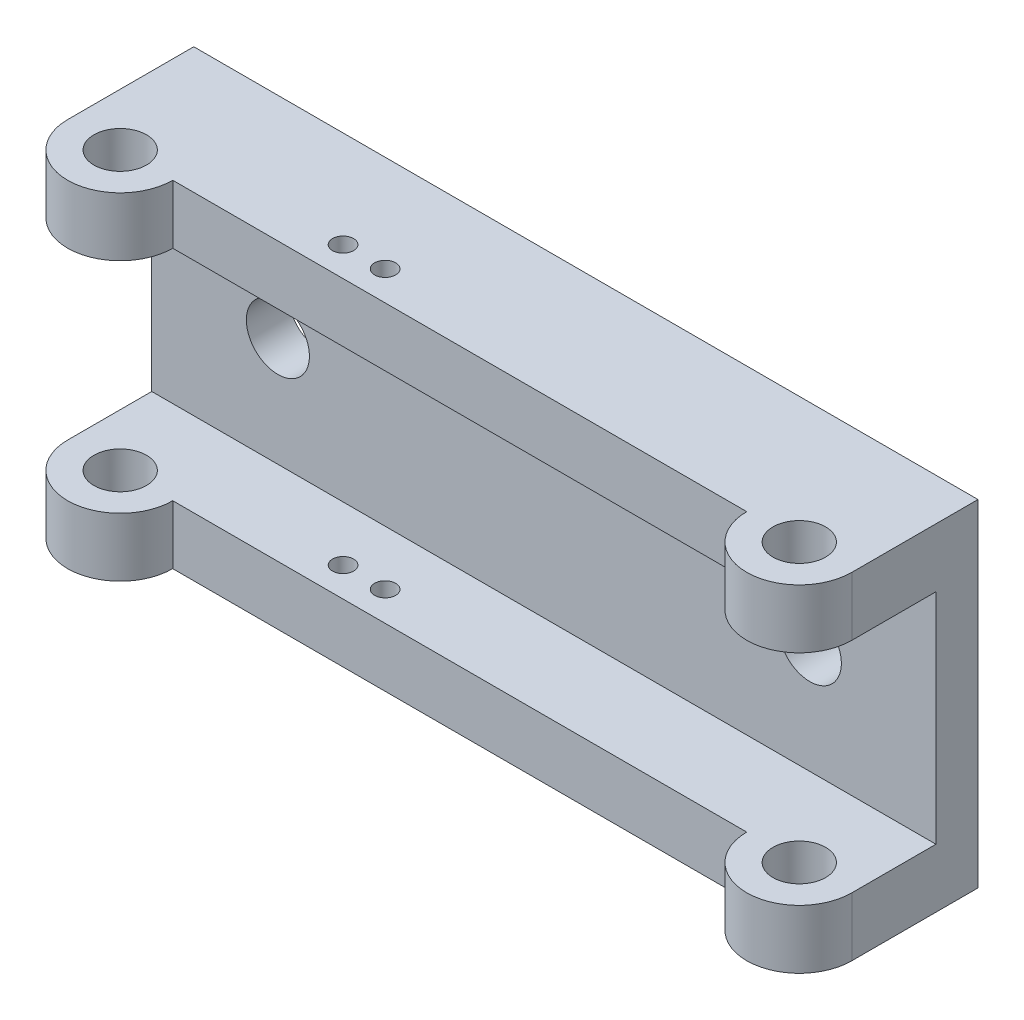
ISO-10303-21;
HEADER;
FILE_DESCRIPTION(('STEP AP214'),'2;1');
FILE_NAME('part.step','',(''),(''),'','','');
FILE_SCHEMA(('AUTOMOTIVE_DESIGN { 1 0 10303 214 1 1 1 1 }'));
ENDSEC;
DATA;
#1=APPLICATION_CONTEXT('core data for automotive mechanical design processes');
#2=APPLICATION_PROTOCOL_DEFINITION('international standard','automotive_design',2000,#1);
#3=PRODUCT_CONTEXT('',#1,'mechanical');
#4=PRODUCT('Part','Part','',(#3));
#5=PRODUCT_RELATED_PRODUCT_CATEGORY('part','',(#4));
#6=PRODUCT_DEFINITION_FORMATION('','',#4);
#7=PRODUCT_DEFINITION_CONTEXT('part definition',#1,'design');
#8=PRODUCT_DEFINITION('design','',#6,#7);
#9=PRODUCT_DEFINITION_SHAPE('','',#8);
#10=(LENGTH_UNIT() NAMED_UNIT(*) SI_UNIT(.MILLI.,.METRE.));
#11=(NAMED_UNIT(*) PLANE_ANGLE_UNIT() SI_UNIT($,.RADIAN.));
#12=(NAMED_UNIT(*) SI_UNIT($,.STERADIAN.) SOLID_ANGLE_UNIT());
#13=UNCERTAINTY_MEASURE_WITH_UNIT(LENGTH_MEASURE(1.E-05),#10,'distance_accuracy_value','');
#14=(GEOMETRIC_REPRESENTATION_CONTEXT(3) GLOBAL_UNCERTAINTY_ASSIGNED_CONTEXT((#13)) GLOBAL_UNIT_ASSIGNED_CONTEXT((#10,
#11,#12)) REPRESENTATION_CONTEXT('',''));
#15=CARTESIAN_POINT('',(0.,0.,0.));
#16=DIRECTION('',(0.,0.,1.));
#17=DIRECTION('',(1.,0.,0.));
#18=AXIS2_PLACEMENT_3D('',#15,#16,#17);
#19=CARTESIAN_POINT('',(118.4275,0.,0.));
#20=DIRECTION('',(1.,0.,0.));
#21=DIRECTION('',(0.,0.,-1.));
#22=AXIS2_PLACEMENT_3D('',#19,#20,#21);
#23=PLANE('',#22);
#24=DIRECTION('',(0.,0.,1.));
#25=VECTOR('',#24,1.);
#26=CARTESIAN_POINT('',(118.4275,25.4,0.));
#27=LINE('',#26,#25);
#28=CARTESIAN_POINT('',(118.4275,25.4,0.));
#29=VERTEX_POINT('',#28);
#30=CARTESIAN_POINT('',(118.4275,25.4,19.05));
#31=VERTEX_POINT('',#30);
#32=EDGE_CURVE('E255',#29,#31,#27,.T.);
#33=ORIENTED_EDGE('',*,*,#32,.T.);
#34=DIRECTION('',(0.,1.,0.));
#35=VECTOR('',#34,1.);
#36=CARTESIAN_POINT('',(118.4275,-151.894566113529,19.05));
#37=LINE('',#36,#35);
#38=CARTESIAN_POINT('',(118.4275,16.51,19.05));
#39=VERTEX_POINT('',#38);
#40=EDGE_CURVE('E12',#31,#39,#37,.F.);
#41=ORIENTED_EDGE('',*,*,#40,.T.);
#42=DIRECTION('',(0.,0.,-1.));
#43=VECTOR('',#42,1.);
#44=CARTESIAN_POINT('',(118.4275,16.51,63.5));
#45=LINE('',#44,#43);
#46=CARTESIAN_POINT('',(118.4275,16.51,6.35));
#47=VERTEX_POINT('',#46);
#48=EDGE_CURVE('E259',#39,#47,#45,.T.);
#49=ORIENTED_EDGE('',*,*,#48,.T.);
#50=DIRECTION('',(0.,-1.,0.));
#51=VECTOR('',#50,1.);
#52=CARTESIAN_POINT('',(118.4275,16.51,6.35));
#53=LINE('',#52,#51);
#54=CARTESIAN_POINT('',(118.4275,-16.51,6.35));
#55=VERTEX_POINT('',#54);
#56=EDGE_CURVE('E263',#47,#55,#53,.T.);
#57=ORIENTED_EDGE('',*,*,#56,.T.);
#58=DIRECTION('',(0.,0.,1.));
#59=VECTOR('',#58,1.);
#60=CARTESIAN_POINT('',(118.4275,-16.51,63.5));
#61=LINE('',#60,#59);
#62=CARTESIAN_POINT('',(118.4275,-16.51,19.05));
#63=VERTEX_POINT('',#62);
#64=EDGE_CURVE('E266',#55,#63,#61,.T.);
#65=ORIENTED_EDGE('',*,*,#64,.T.);
#66=DIRECTION('',(0.,1.,0.));
#67=VECTOR('',#66,1.);
#68=CARTESIAN_POINT('',(118.4275,-151.894566113529,19.05));
#69=LINE('',#68,#67);
#70=CARTESIAN_POINT('',(118.4275,-25.4,19.05));
#71=VERTEX_POINT('',#70);
#72=EDGE_CURVE('E147',#71,#63,#69,.T.);
#73=ORIENTED_EDGE('',*,*,#72,.F.);
#74=DIRECTION('',(0.,0.,-1.));
#75=VECTOR('',#74,1.);
#76=CARTESIAN_POINT('',(118.4275,-25.4,0.));
#77=LINE('',#76,#75);
#78=CARTESIAN_POINT('',(118.4275,-25.4,0.));
#79=VERTEX_POINT('',#78);
#80=EDGE_CURVE('E270',#71,#79,#77,.T.);
#81=ORIENTED_EDGE('',*,*,#80,.T.);
#82=DIRECTION('',(0.,1.,0.));
#83=VECTOR('',#82,1.);
#84=CARTESIAN_POINT('',(118.4275,-25.4,0.));
#85=LINE('',#84,#83);
#86=EDGE_CURVE('E273',#79,#29,#85,.T.);
#87=ORIENTED_EDGE('',*,*,#86,.T.);
#88=EDGE_LOOP('',(#33,#41,#49,#57,#65,#73,#81,#87));
#89=FACE_BOUND('',#88,.T.);
#90=ADVANCED_FACE('F44',(#89),#23,.T.);
#91=CARTESIAN_POINT('',(0.,0.,0.));
#92=DIRECTION('',(1.,0.,0.));
#93=DIRECTION('',(0.,0.,-1.));
#94=AXIS2_PLACEMENT_3D('',#91,#92,#93);
#95=PLANE('',#94);
#96=DIRECTION('',(0.,1.,0.));
#97=VECTOR('',#96,1.);
#98=CARTESIAN_POINT('',(0.,-151.894566113529,19.05));
#99=LINE('',#98,#97);
#100=CARTESIAN_POINT('',(0.,25.4,19.05));
#101=VERTEX_POINT('',#100);
#102=CARTESIAN_POINT('',(0.,16.51,19.05));
#103=VERTEX_POINT('',#102);
#104=EDGE_CURVE('E53',#101,#103,#99,.F.);
#105=ORIENTED_EDGE('',*,*,#104,.F.);
#106=DIRECTION('',(0.,0.,1.));
#107=VECTOR('',#106,1.);
#108=CARTESIAN_POINT('',(0.,25.4,0.));
#109=LINE('',#108,#107);
#110=CARTESIAN_POINT('',(0.,25.4,0.));
#111=VERTEX_POINT('',#110);
#112=EDGE_CURVE('E254',#111,#101,#109,.T.);
#113=ORIENTED_EDGE('',*,*,#112,.F.);
#114=DIRECTION('',(0.,1.,0.));
#115=VECTOR('',#114,1.);
#116=CARTESIAN_POINT('',(0.,-25.4,0.));
#117=LINE('',#116,#115);
#118=CARTESIAN_POINT('',(0.,-25.4,0.));
#119=VERTEX_POINT('',#118);
#120=EDGE_CURVE('E260',#119,#111,#117,.T.);
#121=ORIENTED_EDGE('',*,*,#120,.F.);
#122=DIRECTION('',(0.,0.,-1.));
#123=VECTOR('',#122,1.);
#124=CARTESIAN_POINT('',(0.,-25.4,0.));
#125=LINE('',#124,#123);
#126=CARTESIAN_POINT('',(0.,-25.4,19.05));
#127=VERTEX_POINT('',#126);
#128=EDGE_CURVE('E289',#127,#119,#125,.T.);
#129=ORIENTED_EDGE('',*,*,#128,.F.);
#130=DIRECTION('',(0.,1.,0.));
#131=VECTOR('',#130,1.);
#132=CARTESIAN_POINT('',(0.,-151.894566113529,19.05));
#133=LINE('',#132,#131);
#134=CARTESIAN_POINT('',(0.,-16.51,19.05));
#135=VERTEX_POINT('',#134);
#136=EDGE_CURVE('E185',#127,#135,#133,.T.);
#137=ORIENTED_EDGE('',*,*,#136,.T.);
#138=DIRECTION('',(0.,0.,1.));
#139=VECTOR('',#138,1.);
#140=CARTESIAN_POINT('',(0.,-16.51,63.5));
#141=LINE('',#140,#139);
#142=CARTESIAN_POINT('',(0.,-16.51,6.35));
#143=VERTEX_POINT('',#142);
#144=EDGE_CURVE('E285',#143,#135,#141,.T.);
#145=ORIENTED_EDGE('',*,*,#144,.F.);
#146=DIRECTION('',(0.,-1.,0.));
#147=VECTOR('',#146,1.);
#148=CARTESIAN_POINT('',(0.,16.51,6.35));
#149=LINE('',#148,#147);
#150=CARTESIAN_POINT('',(0.,16.51,6.35));
#151=VERTEX_POINT('',#150);
#152=EDGE_CURVE('E282',#151,#143,#149,.T.);
#153=ORIENTED_EDGE('',*,*,#152,.F.);
#154=DIRECTION('',(0.,0.,-1.));
#155=VECTOR('',#154,1.);
#156=CARTESIAN_POINT('',(0.,16.51,63.5));
#157=LINE('',#156,#155);
#158=EDGE_CURVE('E279',#103,#151,#157,.T.);
#159=ORIENTED_EDGE('',*,*,#158,.F.);
#160=EDGE_LOOP('',(#105,#113,#121,#129,#137,#145,#153,#159));
#161=FACE_BOUND('',#160,.T.);
#162=ADVANCED_FACE('F317',(#161),#95,.F.);
#163=CARTESIAN_POINT('',(118.4275,25.4,0.));
#164=DIRECTION('',(0.,-1.,0.));
#165=DIRECTION('',(0.,0.,-1.));
#166=AXIS2_PLACEMENT_3D('',#163,#164,#165);
#167=PLANE('',#166);
#168=CARTESIAN_POINT('',(110.49,25.4,19.05));
#169=DIRECTION('',(0.,-1.,0.));
#170=DIRECTION('',(0.,0.,-1.));
#171=AXIS2_PLACEMENT_3D('',#168,#169,#170);
#172=CIRCLE('',#171,3.96875000000001);
#173=CARTESIAN_POINT('',(110.49,25.4,15.08125));
#174=VERTEX_POINT('',#173);
#175=EDGE_CURVE('E177',#174,#174,#172,.T.);
#176=ORIENTED_EDGE('',*,*,#175,.T.);
#177=EDGE_LOOP('',(#176));
#178=FACE_BOUND('',#177,.T.);
#179=CARTESIAN_POINT('',(37.1475,25.4,14.605));
#180=DIRECTION('',(0.,-1.,0.));
#181=DIRECTION('',(0.,0.,-1.));
#182=AXIS2_PLACEMENT_3D('',#179,#180,#181);
#183=CIRCLE('',#182,1.5875);
#184=CARTESIAN_POINT('',(37.1475,25.4,13.0175));
#185=VERTEX_POINT('',#184);
#186=EDGE_CURVE('E163',#185,#185,#183,.T.);
#187=ORIENTED_EDGE('',*,*,#186,.T.);
#188=EDGE_LOOP('',(#187));
#189=FACE_BOUND('',#188,.T.);
#190=CARTESIAN_POINT('',(43.4975,25.4,14.605));
#191=DIRECTION('',(0.,-1.,0.));
#192=DIRECTION('',(0.,0.,-1.));
#193=AXIS2_PLACEMENT_3D('',#190,#191,#192);
#194=CIRCLE('',#193,1.5875);
#195=CARTESIAN_POINT('',(43.4975,25.4,13.0175));
#196=VERTEX_POINT('',#195);
#197=EDGE_CURVE('E444',#196,#196,#194,.T.);
#198=ORIENTED_EDGE('',*,*,#197,.T.);
#199=EDGE_LOOP('',(#198));
#200=FACE_BOUND('',#199,.T.);
#201=CARTESIAN_POINT('',(7.9375,25.4,19.05));
#202=DIRECTION('',(0.,-1.,0.));
#203=DIRECTION('',(0.,0.,-1.));
#204=AXIS2_PLACEMENT_3D('',#201,#202,#203);
#205=CIRCLE('',#204,3.96875000000001);
#206=CARTESIAN_POINT('',(7.9375,25.4,15.08125));
#207=VERTEX_POINT('',#206);
#208=EDGE_CURVE('E195',#207,#207,#205,.T.);
#209=ORIENTED_EDGE('',*,*,#208,.T.);
#210=EDGE_LOOP('',(#209));
#211=FACE_BOUND('',#210,.T.);
#212=ORIENTED_EDGE('',*,*,#112,.T.);
#213=CARTESIAN_POINT('',(7.9375,25.4,19.05));
#214=DIRECTION('',(0.,-1.,0.));
#215=DIRECTION('',(0.,0.,-1.));
#216=AXIS2_PLACEMENT_3D('',#213,#214,#215);
#217=CIRCLE('',#216,7.9375);
#218=CARTESIAN_POINT('',(15.875,25.4,19.05));
#219=VERTEX_POINT('',#218);
#220=EDGE_CURVE('E68',#101,#219,#217,.F.);
#221=ORIENTED_EDGE('',*,*,#220,.T.);
#222=DIRECTION('',(1.,0.,0.));
#223=VECTOR('',#222,1.);
#224=CARTESIAN_POINT('',(15.875,25.4,19.05));
#225=LINE('',#224,#223);
#226=CARTESIAN_POINT('',(102.5525,25.4,19.05));
#227=VERTEX_POINT('',#226);
#228=EDGE_CURVE('E140',#219,#227,#225,.T.);
#229=ORIENTED_EDGE('',*,*,#228,.T.);
#230=CARTESIAN_POINT('',(110.49,25.4,19.05));
#231=DIRECTION('',(0.,-1.,0.));
#232=DIRECTION('',(0.,0.,-1.));
#233=AXIS2_PLACEMENT_3D('',#230,#231,#232);
#234=CIRCLE('',#233,7.9375);
#235=EDGE_CURVE('E150',#227,#31,#234,.F.);
#236=ORIENTED_EDGE('',*,*,#235,.T.);
#237=ORIENTED_EDGE('',*,*,#32,.F.);
#238=DIRECTION('',(-1.,0.,0.));
#239=VECTOR('',#238,1.);
#240=CARTESIAN_POINT('',(118.4275,25.4,0.));
#241=LINE('',#240,#239);
#242=EDGE_CURVE('E275',#29,#111,#241,.T.);
#243=ORIENTED_EDGE('',*,*,#242,.T.);
#244=EDGE_LOOP('',(#212,#221,#229,#236,#237,#243));
#245=FACE_BOUND('',#244,.T.);
#246=ADVANCED_FACE('F46',(#178,#189,#200,#211,#245),#167,.F.);
#247=CARTESIAN_POINT('',(118.4275,16.51,63.5));
#248=DIRECTION('',(0.,1.,0.));
#249=DIRECTION('',(0.,0.,1.));
#250=AXIS2_PLACEMENT_3D('',#247,#248,#249);
#251=PLANE('',#250);
#252=CARTESIAN_POINT('',(110.49,16.51,19.05));
#253=DIRECTION('',(0.,1.,0.));
#254=DIRECTION('',(0.,0.,1.));
#255=AXIS2_PLACEMENT_3D('',#252,#253,#254);
#256=CIRCLE('',#255,3.96875000000001);
#257=CARTESIAN_POINT('',(110.49,16.51,23.01875));
#258=VERTEX_POINT('',#257);
#259=EDGE_CURVE('E244',#258,#258,#256,.T.);
#260=ORIENTED_EDGE('',*,*,#259,.T.);
#261=EDGE_LOOP('',(#260));
#262=FACE_BOUND('',#261,.T.);
#263=CARTESIAN_POINT('',(37.1475,16.51,14.605));
#264=DIRECTION('',(0.,1.,0.));
#265=DIRECTION('',(0.,0.,1.));
#266=AXIS2_PLACEMENT_3D('',#263,#264,#265);
#267=CIRCLE('',#266,1.5875);
#268=CARTESIAN_POINT('',(37.1475,16.51,16.1925));
#269=VERTEX_POINT('',#268);
#270=EDGE_CURVE('E236',#269,#269,#267,.T.);
#271=ORIENTED_EDGE('',*,*,#270,.T.);
#272=EDGE_LOOP('',(#271));
#273=FACE_BOUND('',#272,.T.);
#274=CARTESIAN_POINT('',(43.4975,16.51,14.605));
#275=DIRECTION('',(0.,1.,0.));
#276=DIRECTION('',(0.,0.,1.));
#277=AXIS2_PLACEMENT_3D('',#274,#275,#276);
#278=CIRCLE('',#277,1.5875);
#279=CARTESIAN_POINT('',(43.4975,16.51,16.1925));
#280=VERTEX_POINT('',#279);
#281=EDGE_CURVE('E228',#280,#280,#278,.T.);
#282=ORIENTED_EDGE('',*,*,#281,.T.);
#283=EDGE_LOOP('',(#282));
#284=FACE_BOUND('',#283,.T.);
#285=CARTESIAN_POINT('',(7.9375,16.51,19.05));
#286=DIRECTION('',(0.,1.,0.));
#287=DIRECTION('',(0.,0.,1.));
#288=AXIS2_PLACEMENT_3D('',#285,#286,#287);
#289=CIRCLE('',#288,3.96875000000001);
#290=CARTESIAN_POINT('',(7.9375,16.51,23.01875));
#291=VERTEX_POINT('',#290);
#292=EDGE_CURVE('E220',#291,#291,#289,.T.);
#293=ORIENTED_EDGE('',*,*,#292,.T.);
#294=EDGE_LOOP('',(#293));
#295=FACE_BOUND('',#294,.T.);
#296=DIRECTION('',(-1.,0.,0.));
#297=VECTOR('',#296,1.);
#298=CARTESIAN_POINT('',(118.4275,16.51,19.05));
#299=LINE('',#298,#297);
#300=CARTESIAN_POINT('',(102.5525,16.51,19.05));
#301=VERTEX_POINT('',#300);
#302=CARTESIAN_POINT('',(15.875,16.51,19.05));
#303=VERTEX_POINT('',#302);
#304=EDGE_CURVE('E142',#301,#303,#299,.T.);
#305=ORIENTED_EDGE('',*,*,#304,.T.);
#306=CARTESIAN_POINT('',(7.9375,16.51,19.05));
#307=DIRECTION('',(0.,1.,0.));
#308=DIRECTION('',(0.,0.,1.));
#309=AXIS2_PLACEMENT_3D('',#306,#307,#308);
#310=CIRCLE('',#309,7.9375);
#311=EDGE_CURVE('E205',#303,#103,#310,.F.);
#312=ORIENTED_EDGE('',*,*,#311,.T.);
#313=ORIENTED_EDGE('',*,*,#158,.T.);
#314=DIRECTION('',(-1.,0.,0.));
#315=VECTOR('',#314,1.);
#316=CARTESIAN_POINT('',(118.4275,16.51,6.35));
#317=LINE('',#316,#315);
#318=EDGE_CURVE('E305',#47,#151,#317,.T.);
#319=ORIENTED_EDGE('',*,*,#318,.F.);
#320=ORIENTED_EDGE('',*,*,#48,.F.);
#321=CARTESIAN_POINT('',(110.49,16.51,19.05));
#322=DIRECTION('',(0.,1.,0.));
#323=DIRECTION('',(0.,0.,1.));
#324=AXIS2_PLACEMENT_3D('',#321,#322,#323);
#325=CIRCLE('',#324,7.9375);
#326=EDGE_CURVE('E213',#39,#301,#325,.F.);
#327=ORIENTED_EDGE('',*,*,#326,.T.);
#328=EDGE_LOOP('',(#305,#312,#313,#319,#320,#327));
#329=FACE_BOUND('',#328,.T.);
#330=ADVANCED_FACE('F314',(#262,#273,#284,#295,#329),#251,.F.);
#331=CARTESIAN_POINT('',(118.4275,16.51,6.35));
#332=DIRECTION('',(0.,0.,-1.));
#333=DIRECTION('',(-1.,0.,0.));
#334=AXIS2_PLACEMENT_3D('',#331,#332,#333);
#335=PLANE('',#334);
#336=CARTESIAN_POINT('',(19.05,0.,6.35));
#337=DIRECTION('',(0.,0.,-1.));
#338=DIRECTION('',(-1.,0.,0.));
#339=AXIS2_PLACEMENT_3D('',#336,#337,#338);
#340=CIRCLE('',#339,4.7625);
#341=CARTESIAN_POINT('',(14.2875,0.,6.35));
#342=VERTEX_POINT('',#341);
#343=EDGE_CURVE('E447',#342,#342,#340,.T.);
#344=ORIENTED_EDGE('',*,*,#343,.T.);
#345=EDGE_LOOP('',(#344));
#346=FACE_BOUND('',#345,.T.);
#347=CARTESIAN_POINT('',(99.3775,0.,6.35));
#348=DIRECTION('',(0.,0.,-1.));
#349=DIRECTION('',(-1.,0.,0.));
#350=AXIS2_PLACEMENT_3D('',#347,#348,#349);
#351=CIRCLE('',#350,4.76250000000001);
#352=CARTESIAN_POINT('',(94.615,0.,6.35));
#353=VERTEX_POINT('',#352);
#354=EDGE_CURVE('E459',#353,#353,#351,.T.);
#355=ORIENTED_EDGE('',*,*,#354,.T.);
#356=EDGE_LOOP('',(#355));
#357=FACE_BOUND('',#356,.T.);
#358=ORIENTED_EDGE('',*,*,#152,.T.);
#359=DIRECTION('',(-1.,0.,0.));
#360=VECTOR('',#359,1.);
#361=CARTESIAN_POINT('',(118.4275,-16.51,6.35));
#362=LINE('',#361,#360);
#363=EDGE_CURVE('E301',#55,#143,#362,.T.);
#364=ORIENTED_EDGE('',*,*,#363,.F.);
#365=ORIENTED_EDGE('',*,*,#56,.F.);
#366=ORIENTED_EDGE('',*,*,#318,.T.);
#367=EDGE_LOOP('',(#358,#364,#365,#366));
#368=FACE_BOUND('',#367,.T.);
#369=ADVANCED_FACE('F321',(#346,#357,#368),#335,.F.);
#370=CARTESIAN_POINT('',(118.4275,-16.51,63.5));
#371=DIRECTION('',(0.,-1.,0.));
#372=DIRECTION('',(0.,0.,-1.));
#373=AXIS2_PLACEMENT_3D('',#370,#371,#372);
#374=PLANE('',#373);
#375=CARTESIAN_POINT('',(110.49,-16.51,19.05));
#376=DIRECTION('',(0.,-1.,0.));
#377=DIRECTION('',(0.,0.,-1.));
#378=AXIS2_PLACEMENT_3D('',#375,#376,#377);
#379=CIRCLE('',#378,3.96875000000001);
#380=CARTESIAN_POINT('',(110.49,-16.51,15.08125));
#381=VERTEX_POINT('',#380);
#382=EDGE_CURVE('E240',#381,#381,#379,.T.);
#383=ORIENTED_EDGE('',*,*,#382,.T.);
#384=EDGE_LOOP('',(#383));
#385=FACE_BOUND('',#384,.T.);
#386=CARTESIAN_POINT('',(37.1475,-16.51,14.605));
#387=DIRECTION('',(0.,-1.,0.));
#388=DIRECTION('',(0.,0.,-1.));
#389=AXIS2_PLACEMENT_3D('',#386,#387,#388);
#390=CIRCLE('',#389,1.5875);
#391=CARTESIAN_POINT('',(37.1475,-16.51,13.0175));
#392=VERTEX_POINT('',#391);
#393=EDGE_CURVE('E232',#392,#392,#390,.T.);
#394=ORIENTED_EDGE('',*,*,#393,.T.);
#395=EDGE_LOOP('',(#394));
#396=FACE_BOUND('',#395,.T.);
#397=CARTESIAN_POINT('',(43.4975,-16.51,14.605));
#398=DIRECTION('',(0.,-1.,0.));
#399=DIRECTION('',(0.,0.,-1.));
#400=AXIS2_PLACEMENT_3D('',#397,#398,#399);
#401=CIRCLE('',#400,1.5875);
#402=CARTESIAN_POINT('',(43.4975,-16.51,13.0175));
#403=VERTEX_POINT('',#402);
#404=EDGE_CURVE('E224',#403,#403,#401,.T.);
#405=ORIENTED_EDGE('',*,*,#404,.T.);
#406=EDGE_LOOP('',(#405));
#407=FACE_BOUND('',#406,.T.);
#408=CARTESIAN_POINT('',(7.9375,-16.51,19.05));
#409=DIRECTION('',(0.,-1.,0.));
#410=DIRECTION('',(0.,0.,-1.));
#411=AXIS2_PLACEMENT_3D('',#408,#409,#410);
#412=CIRCLE('',#411,3.96875000000001);
#413=CARTESIAN_POINT('',(7.9375,-16.51,15.08125));
#414=VERTEX_POINT('',#413);
#415=EDGE_CURVE('E216',#414,#414,#412,.T.);
#416=ORIENTED_EDGE('',*,*,#415,.T.);
#417=EDGE_LOOP('',(#416));
#418=FACE_BOUND('',#417,.T.);
#419=ORIENTED_EDGE('',*,*,#144,.T.);
#420=CARTESIAN_POINT('',(7.9375,-16.51,19.05));
#421=DIRECTION('',(0.,-1.,0.));
#422=DIRECTION('',(0.,0.,-1.));
#423=AXIS2_PLACEMENT_3D('',#420,#421,#422);
#424=CIRCLE('',#423,7.9375);
#425=CARTESIAN_POINT('',(15.875,-16.51,19.05));
#426=VERTEX_POINT('',#425);
#427=EDGE_CURVE('E60',#135,#426,#424,.F.);
#428=ORIENTED_EDGE('',*,*,#427,.T.);
#429=DIRECTION('',(1.,0.,0.));
#430=VECTOR('',#429,1.);
#431=CARTESIAN_POINT('',(118.4275,-16.51,19.05));
#432=LINE('',#431,#430);
#433=CARTESIAN_POINT('',(102.5525,-16.51,19.05));
#434=VERTEX_POINT('',#433);
#435=EDGE_CURVE('E248',#426,#434,#432,.T.);
#436=ORIENTED_EDGE('',*,*,#435,.T.);
#437=CARTESIAN_POINT('',(110.49,-16.51,19.05));
#438=DIRECTION('',(0.,-1.,0.));
#439=DIRECTION('',(0.,0.,-1.));
#440=AXIS2_PLACEMENT_3D('',#437,#438,#439);
#441=CIRCLE('',#440,7.9375);
#442=EDGE_CURVE('E209',#434,#63,#441,.F.);
#443=ORIENTED_EDGE('',*,*,#442,.T.);
#444=ORIENTED_EDGE('',*,*,#64,.F.);
#445=ORIENTED_EDGE('',*,*,#363,.T.);
#446=EDGE_LOOP('',(#419,#428,#436,#443,#444,#445));
#447=FACE_BOUND('',#446,.T.);
#448=ADVANCED_FACE('F325',(#385,#396,#407,#418,#447),#374,.F.);
#449=CARTESIAN_POINT('',(118.4275,-25.4,0.));
#450=DIRECTION('',(0.,1.,0.));
#451=DIRECTION('',(0.,0.,1.));
#452=AXIS2_PLACEMENT_3D('',#449,#450,#451);
#453=PLANE('',#452);
#454=CARTESIAN_POINT('',(110.49,-25.4,19.05));
#455=DIRECTION('',(0.,1.,0.));
#456=DIRECTION('',(0.,0.,1.));
#457=AXIS2_PLACEMENT_3D('',#454,#455,#456);
#458=CIRCLE('',#457,3.96875000000001);
#459=CARTESIAN_POINT('',(110.49,-25.4,23.01875));
#460=VERTEX_POINT('',#459);
#461=EDGE_CURVE('E191',#460,#460,#458,.F.);
#462=ORIENTED_EDGE('',*,*,#461,.F.);
#463=EDGE_LOOP('',(#462));
#464=FACE_BOUND('',#463,.T.);
#465=CARTESIAN_POINT('',(37.1475,-25.4,14.605));
#466=DIRECTION('',(0.,1.,0.));
#467=DIRECTION('',(0.,0.,1.));
#468=AXIS2_PLACEMENT_3D('',#465,#466,#467);
#469=CIRCLE('',#468,1.5875);
#470=CARTESIAN_POINT('',(37.1475,-25.4,16.1925));
#471=VERTEX_POINT('',#470);
#472=EDGE_CURVE('E159',#471,#471,#469,.F.);
#473=ORIENTED_EDGE('',*,*,#472,.F.);
#474=EDGE_LOOP('',(#473));
#475=FACE_BOUND('',#474,.T.);
#476=CARTESIAN_POINT('',(43.4975,-25.4,14.605));
#477=DIRECTION('',(0.,1.,0.));
#478=DIRECTION('',(0.,0.,1.));
#479=AXIS2_PLACEMENT_3D('',#476,#477,#478);
#480=CIRCLE('',#479,1.5875);
#481=CARTESIAN_POINT('',(43.4975,-25.4,16.1925));
#482=VERTEX_POINT('',#481);
#483=EDGE_CURVE('E446',#482,#482,#480,.F.);
#484=ORIENTED_EDGE('',*,*,#483,.F.);
#485=EDGE_LOOP('',(#484));
#486=FACE_BOUND('',#485,.T.);
#487=CARTESIAN_POINT('',(7.9375,-25.4,19.05));
#488=DIRECTION('',(0.,1.,0.));
#489=DIRECTION('',(0.,0.,1.));
#490=AXIS2_PLACEMENT_3D('',#487,#488,#489);
#491=CIRCLE('',#490,3.96875000000001);
#492=CARTESIAN_POINT('',(7.9375,-25.4,23.01875));
#493=VERTEX_POINT('',#492);
#494=EDGE_CURVE('E199',#493,#493,#491,.F.);
#495=ORIENTED_EDGE('',*,*,#494,.F.);
#496=EDGE_LOOP('',(#495));
#497=FACE_BOUND('',#496,.T.);
#498=DIRECTION('',(1.,0.,0.));
#499=VECTOR('',#498,1.);
#500=CARTESIAN_POINT('',(15.875,-25.4,19.05));
#501=LINE('',#500,#499);
#502=CARTESIAN_POINT('',(15.875,-25.4,19.05));
#503=VERTEX_POINT('',#502);
#504=CARTESIAN_POINT('',(102.5525,-25.4,19.05));
#505=VERTEX_POINT('',#504);
#506=EDGE_CURVE('E170',#503,#505,#501,.T.);
#507=ORIENTED_EDGE('',*,*,#506,.F.);
#508=CARTESIAN_POINT('',(7.9375,-25.4,19.05));
#509=DIRECTION('',(0.,1.,0.));
#510=DIRECTION('',(0.,0.,1.));
#511=AXIS2_PLACEMENT_3D('',#508,#509,#510);
#512=CIRCLE('',#511,7.9375);
#513=EDGE_CURVE('E174',#127,#503,#512,.T.);
#514=ORIENTED_EDGE('',*,*,#513,.F.);
#515=ORIENTED_EDGE('',*,*,#128,.T.);
#516=DIRECTION('',(-1.,0.,0.));
#517=VECTOR('',#516,1.);
#518=CARTESIAN_POINT('',(118.4275,-25.4,0.));
#519=LINE('',#518,#517);
#520=EDGE_CURVE('E297',#79,#119,#519,.T.);
#521=ORIENTED_EDGE('',*,*,#520,.F.);
#522=ORIENTED_EDGE('',*,*,#80,.F.);
#523=CARTESIAN_POINT('',(110.49,-25.4,19.05));
#524=DIRECTION('',(0.,1.,0.));
#525=DIRECTION('',(0.,0.,1.));
#526=AXIS2_PLACEMENT_3D('',#523,#524,#525);
#527=CIRCLE('',#526,7.9375);
#528=EDGE_CURVE('E167',#505,#71,#527,.T.);
#529=ORIENTED_EDGE('',*,*,#528,.F.);
#530=EDGE_LOOP('',(#507,#514,#515,#521,#522,#529));
#531=FACE_BOUND('',#530,.T.);
#532=ADVANCED_FACE('F339',(#464,#475,#486,#497,#531),#453,.F.);
#533=CARTESIAN_POINT('',(118.4275,-25.4,0.));
#534=DIRECTION('',(0.,0.,1.));
#535=DIRECTION('',(1.,0.,0.));
#536=AXIS2_PLACEMENT_3D('',#533,#534,#535);
#537=PLANE('',#536);
#538=CARTESIAN_POINT('',(19.05,0.,0.));
#539=DIRECTION('',(0.,0.,1.));
#540=DIRECTION('',(1.,0.,0.));
#541=AXIS2_PLACEMENT_3D('',#538,#539,#540);
#542=CIRCLE('',#541,4.7625);
#543=CARTESIAN_POINT('',(23.8125,0.,0.));
#544=VERTEX_POINT('',#543);
#545=EDGE_CURVE('E454',#544,#544,#542,.T.);
#546=ORIENTED_EDGE('',*,*,#545,.T.);
#547=EDGE_LOOP('',(#546));
#548=FACE_BOUND('',#547,.T.);
#549=CARTESIAN_POINT('',(99.3775,0.,0.));
#550=DIRECTION('',(0.,0.,1.));
#551=DIRECTION('',(1.,0.,0.));
#552=AXIS2_PLACEMENT_3D('',#549,#550,#551);
#553=CIRCLE('',#552,4.76250000000001);
#554=CARTESIAN_POINT('',(104.14,0.,0.));
#555=VERTEX_POINT('',#554);
#556=EDGE_CURVE('E463',#555,#555,#553,.T.);
#557=ORIENTED_EDGE('',*,*,#556,.T.);
#558=EDGE_LOOP('',(#557));
#559=FACE_BOUND('',#558,.T.);
#560=ORIENTED_EDGE('',*,*,#120,.T.);
#561=ORIENTED_EDGE('',*,*,#242,.F.);
#562=ORIENTED_EDGE('',*,*,#86,.F.);
#563=ORIENTED_EDGE('',*,*,#520,.T.);
#564=EDGE_LOOP('',(#560,#561,#562,#563));
#565=FACE_BOUND('',#564,.T.);
#566=ADVANCED_FACE('F335',(#548,#559,#565),#537,.F.);
#567=CARTESIAN_POINT('',(110.49,-151.894566113529,19.05));
#568=DIRECTION('',(0.,1.,0.));
#569=DIRECTION('',(0.,0.,1.));
#570=AXIS2_PLACEMENT_3D('',#567,#568,#569);
#571=CYLINDRICAL_SURFACE('',#570,7.9375);
#572=DIRECTION('',(0.,1.,0.));
#573=VECTOR('',#572,1.);
#574=CARTESIAN_POINT('',(102.5525,-151.894566113529,19.05));
#575=LINE('',#574,#573);
#576=EDGE_CURVE('E146',#505,#434,#575,.T.);
#577=ORIENTED_EDGE('',*,*,#576,.F.);
#578=ORIENTED_EDGE('',*,*,#528,.T.);
#579=ORIENTED_EDGE('',*,*,#72,.T.);
#580=ORIENTED_EDGE('',*,*,#442,.F.);
#581=EDGE_LOOP('',(#577,#578,#579,#580));
#582=FACE_BOUND('',#581,.T.);
#583=ADVANCED_FACE('F348',(#582),#571,.T.);
#584=CARTESIAN_POINT('',(7.9375,-151.894566113529,19.05));
#585=DIRECTION('',(0.,1.,0.));
#586=DIRECTION('',(0.,0.,1.));
#587=AXIS2_PLACEMENT_3D('',#584,#585,#586);
#588=CYLINDRICAL_SURFACE('',#587,7.9375);
#589=ORIENTED_EDGE('',*,*,#136,.F.);
#590=ORIENTED_EDGE('',*,*,#513,.T.);
#591=DIRECTION('',(0.,1.,0.));
#592=VECTOR('',#591,1.);
#593=CARTESIAN_POINT('',(15.875,-151.894566113529,19.05));
#594=LINE('',#593,#592);
#595=EDGE_CURVE('E171',#503,#426,#594,.T.);
#596=ORIENTED_EDGE('',*,*,#595,.T.);
#597=ORIENTED_EDGE('',*,*,#427,.F.);
#598=EDGE_LOOP('',(#589,#590,#596,#597));
#599=FACE_BOUND('',#598,.T.);
#600=ADVANCED_FACE('F343',(#599),#588,.T.);
#601=CARTESIAN_POINT('',(15.875,-151.894566113529,19.05));
#602=DIRECTION('',(0.,0.,-1.));
#603=DIRECTION('',(-1.,0.,0.));
#604=AXIS2_PLACEMENT_3D('',#601,#602,#603);
#605=PLANE('',#604);
#606=ORIENTED_EDGE('',*,*,#595,.F.);
#607=ORIENTED_EDGE('',*,*,#506,.T.);
#608=ORIENTED_EDGE('',*,*,#576,.T.);
#609=ORIENTED_EDGE('',*,*,#435,.F.);
#610=EDGE_LOOP('',(#606,#607,#608,#609));
#611=FACE_BOUND('',#610,.T.);
#612=ADVANCED_FACE('F345',(#611),#605,.F.);
#613=EDGE_CURVE('E135',#301,#227,#575,.T.);
#614=ORIENTED_EDGE('',*,*,#613,.T.);
#615=ORIENTED_EDGE('',*,*,#228,.F.);
#616=EDGE_CURVE('E179',#303,#219,#594,.T.);
#617=ORIENTED_EDGE('',*,*,#616,.F.);
#618=ORIENTED_EDGE('',*,*,#304,.F.);
#619=EDGE_LOOP('',(#614,#615,#617,#618));
#620=FACE_BOUND('',#619,.T.);
#621=ADVANCED_FACE('F137',(#620),#605,.F.);
#622=ORIENTED_EDGE('',*,*,#40,.F.);
#623=ORIENTED_EDGE('',*,*,#235,.F.);
#624=ORIENTED_EDGE('',*,*,#613,.F.);
#625=ORIENTED_EDGE('',*,*,#326,.F.);
#626=EDGE_LOOP('',(#622,#623,#624,#625));
#627=FACE_BOUND('',#626,.T.);
#628=ADVANCED_FACE('F151',(#627),#571,.T.);
#629=ORIENTED_EDGE('',*,*,#616,.T.);
#630=ORIENTED_EDGE('',*,*,#220,.F.);
#631=ORIENTED_EDGE('',*,*,#104,.T.);
#632=ORIENTED_EDGE('',*,*,#311,.F.);
#633=EDGE_LOOP('',(#629,#630,#631,#632));
#634=FACE_BOUND('',#633,.T.);
#635=ADVANCED_FACE('F309',(#634),#588,.T.);
#636=CARTESIAN_POINT('',(7.9375,-151.894566113529,19.05));
#637=DIRECTION('',(0.,1.,0.));
#638=DIRECTION('',(0.,0.,1.));
#639=AXIS2_PLACEMENT_3D('',#636,#637,#638);
#640=CYLINDRICAL_SURFACE('',#639,3.96875000000001);
#641=ORIENTED_EDGE('',*,*,#494,.T.);
#642=EDGE_LOOP('',(#641));
#643=FACE_BOUND('',#642,.T.);
#644=ORIENTED_EDGE('',*,*,#415,.F.);
#645=EDGE_LOOP('',(#644));
#646=FACE_BOUND('',#645,.T.);
#647=ADVANCED_FACE('F396',(#643,#646),#640,.F.);
#648=CARTESIAN_POINT('',(43.4975,-151.894566113529,14.605));
#649=DIRECTION('',(0.,1.,0.));
#650=DIRECTION('',(0.,0.,1.));
#651=AXIS2_PLACEMENT_3D('',#648,#649,#650);
#652=CYLINDRICAL_SURFACE('',#651,1.5875);
#653=ORIENTED_EDGE('',*,*,#483,.T.);
#654=EDGE_LOOP('',(#653));
#655=FACE_BOUND('',#654,.T.);
#656=ORIENTED_EDGE('',*,*,#404,.F.);
#657=EDGE_LOOP('',(#656));
#658=FACE_BOUND('',#657,.T.);
#659=ADVANCED_FACE('F404',(#655,#658),#652,.F.);
#660=CARTESIAN_POINT('',(37.1475,-151.894566113529,14.605));
#661=DIRECTION('',(0.,1.,0.));
#662=DIRECTION('',(0.,0.,1.));
#663=AXIS2_PLACEMENT_3D('',#660,#661,#662);
#664=CYLINDRICAL_SURFACE('',#663,1.5875);
#665=ORIENTED_EDGE('',*,*,#472,.T.);
#666=EDGE_LOOP('',(#665));
#667=FACE_BOUND('',#666,.T.);
#668=ORIENTED_EDGE('',*,*,#393,.F.);
#669=EDGE_LOOP('',(#668));
#670=FACE_BOUND('',#669,.T.);
#671=ADVANCED_FACE('F405',(#667,#670),#664,.F.);
#672=CARTESIAN_POINT('',(110.49,-151.894566113529,19.05));
#673=DIRECTION('',(0.,1.,0.));
#674=DIRECTION('',(0.,0.,1.));
#675=AXIS2_PLACEMENT_3D('',#672,#673,#674);
#676=CYLINDRICAL_SURFACE('',#675,3.96875000000001);
#677=ORIENTED_EDGE('',*,*,#461,.T.);
#678=EDGE_LOOP('',(#677));
#679=FACE_BOUND('',#678,.T.);
#680=ORIENTED_EDGE('',*,*,#382,.F.);
#681=EDGE_LOOP('',(#680));
#682=FACE_BOUND('',#681,.T.);
#683=ADVANCED_FACE('F394',(#679,#682),#676,.F.);
#684=ORIENTED_EDGE('',*,*,#208,.F.);
#685=EDGE_LOOP('',(#684));
#686=FACE_BOUND('',#685,.T.);
#687=ORIENTED_EDGE('',*,*,#292,.F.);
#688=EDGE_LOOP('',(#687));
#689=FACE_BOUND('',#688,.T.);
#690=ADVANCED_FACE('F367',(#686,#689),#640,.F.);
#691=ORIENTED_EDGE('',*,*,#197,.F.);
#692=EDGE_LOOP('',(#691));
#693=FACE_BOUND('',#692,.T.);
#694=ORIENTED_EDGE('',*,*,#281,.F.);
#695=EDGE_LOOP('',(#694));
#696=FACE_BOUND('',#695,.T.);
#697=ADVANCED_FACE('F393',(#693,#696),#652,.F.);
#698=ORIENTED_EDGE('',*,*,#186,.F.);
#699=EDGE_LOOP('',(#698));
#700=FACE_BOUND('',#699,.T.);
#701=ORIENTED_EDGE('',*,*,#270,.F.);
#702=EDGE_LOOP('',(#701));
#703=FACE_BOUND('',#702,.T.);
#704=ADVANCED_FACE('F401',(#700,#703),#664,.F.);
#705=ORIENTED_EDGE('',*,*,#175,.F.);
#706=EDGE_LOOP('',(#705));
#707=FACE_BOUND('',#706,.T.);
#708=ORIENTED_EDGE('',*,*,#259,.F.);
#709=EDGE_LOOP('',(#708));
#710=FACE_BOUND('',#709,.T.);
#711=ADVANCED_FACE('F407',(#707,#710),#676,.F.);
#712=CARTESIAN_POINT('',(99.3775,0.,19.8203841816038));
#713=DIRECTION('',(0.,0.,-1.));
#714=DIRECTION('',(-1.,0.,0.));
#715=AXIS2_PLACEMENT_3D('',#712,#713,#714);
#716=CYLINDRICAL_SURFACE('',#715,4.76250000000001);
#717=ORIENTED_EDGE('',*,*,#354,.F.);
#718=EDGE_LOOP('',(#717));
#719=FACE_BOUND('',#718,.T.);
#720=ORIENTED_EDGE('',*,*,#556,.F.);
#721=EDGE_LOOP('',(#720));
#722=FACE_BOUND('',#721,.T.);
#723=ADVANCED_FACE('F424',(#719,#722),#716,.F.);
#724=CARTESIAN_POINT('',(19.05,0.,19.8203841816038));
#725=DIRECTION('',(0.,0.,-1.));
#726=DIRECTION('',(-1.,0.,0.));
#727=AXIS2_PLACEMENT_3D('',#724,#725,#726);
#728=CYLINDRICAL_SURFACE('',#727,4.7625);
#729=ORIENTED_EDGE('',*,*,#343,.F.);
#730=EDGE_LOOP('',(#729));
#731=FACE_BOUND('',#730,.T.);
#732=ORIENTED_EDGE('',*,*,#545,.F.);
#733=EDGE_LOOP('',(#732));
#734=FACE_BOUND('',#733,.T.);
#735=ADVANCED_FACE('F430',(#731,#734),#728,.F.);
#736=CLOSED_SHELL('',(#90,#162,#246,#330,#369,#448,#532,#566,#583,#600,#612,#621,#628,#635,#647,
#659,#671,#683,#690,#697,#704,#711,#723,#735));
#737=MANIFOLD_SOLID_BREP('B2',#736);
#738=ADVANCED_BREP_SHAPE_REPRESENTATION('',(#18,#737),#14);
#739=SHAPE_DEFINITION_REPRESENTATION(#9,#738);
ENDSEC;
END-ISO-10303-21;
